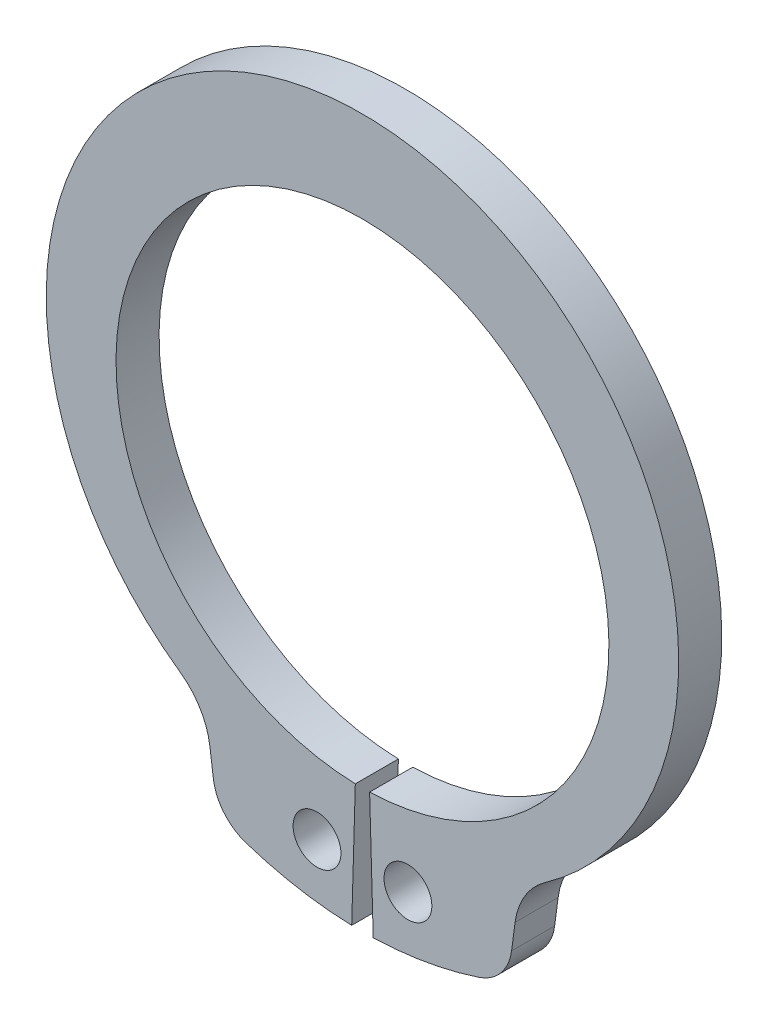
ISO-10303-21;
HEADER;
FILE_DESCRIPTION(('STEP AP214'),'2;1');
FILE_NAME('part.step','',(''),(''),'','','');
FILE_SCHEMA(('AUTOMOTIVE_DESIGN { 1 0 10303 214 1 1 1 1 }'));
ENDSEC;
DATA;
#1=APPLICATION_CONTEXT('core data for automotive mechanical design processes');
#2=APPLICATION_PROTOCOL_DEFINITION('international standard','automotive_design',2000,#1);
#3=PRODUCT_CONTEXT('',#1,'mechanical');
#4=PRODUCT('Part','Part','',(#3));
#5=PRODUCT_RELATED_PRODUCT_CATEGORY('part','',(#4));
#6=PRODUCT_DEFINITION_FORMATION('','',#4);
#7=PRODUCT_DEFINITION_CONTEXT('part definition',#1,'design');
#8=PRODUCT_DEFINITION('design','',#6,#7);
#9=PRODUCT_DEFINITION_SHAPE('','',#8);
#10=(LENGTH_UNIT() NAMED_UNIT(*) SI_UNIT(.MILLI.,.METRE.));
#11=(NAMED_UNIT(*) PLANE_ANGLE_UNIT() SI_UNIT($,.RADIAN.));
#12=(NAMED_UNIT(*) SI_UNIT($,.STERADIAN.) SOLID_ANGLE_UNIT());
#13=UNCERTAINTY_MEASURE_WITH_UNIT(LENGTH_MEASURE(1.E-05),#10,'distance_accuracy_value','');
#14=(GEOMETRIC_REPRESENTATION_CONTEXT(3) GLOBAL_UNCERTAINTY_ASSIGNED_CONTEXT((#13)) GLOBAL_UNIT_ASSIGNED_CONTEXT((#10,
#11,#12)) REPRESENTATION_CONTEXT('',''));
#15=CARTESIAN_POINT('',(0.,0.,0.));
#16=DIRECTION('',(0.,0.,1.));
#17=DIRECTION('',(1.,0.,0.));
#18=AXIS2_PLACEMENT_3D('',#15,#16,#17);
#19=CARTESIAN_POINT('',(0.,0.,-0.9));
#20=DIRECTION('',(0.,0.,1.));
#21=DIRECTION('',(1.,0.,0.));
#22=AXIS2_PLACEMENT_3D('',#19,#20,#21);
#23=CYLINDRICAL_SURFACE('',#22,5.15);
#24=CARTESIAN_POINT('',(0.,0.,0.));
#25=DIRECTION('',(0.,0.,-1.));
#26=DIRECTION('',(1.,0.,0.));
#27=AXIS2_PLACEMENT_3D('',#24,#25,#26);
#28=CIRCLE('',#27,5.15);
#29=CARTESIAN_POINT('',(-0.149516129032258,-5.14782914704434,0.));
#30=VERTEX_POINT('',#29);
#31=CARTESIAN_POINT('',(0.149516129032258,-5.14782914704434,0.));
#32=VERTEX_POINT('',#31);
#33=EDGE_CURVE('E151',#30,#32,#28,.T.);
#34=ORIENTED_EDGE('',*,*,#33,.F.);
#35=DIRECTION('',(0.,0.,1.));
#36=VECTOR('',#35,1.);
#37=CARTESIAN_POINT('',(-0.149516129032258,-5.14782914704434,-0.9));
#38=LINE('',#37,#36);
#39=CARTESIAN_POINT('',(-0.149516129032258,-5.14782914704434,-0.9));
#40=VERTEX_POINT('',#39);
#41=EDGE_CURVE('E11',#40,#30,#38,.T.);
#42=ORIENTED_EDGE('',*,*,#41,.F.);
#43=CARTESIAN_POINT('',(0.,0.,-0.9));
#44=DIRECTION('',(0.,0.,-1.));
#45=DIRECTION('',(1.,0.,0.));
#46=AXIS2_PLACEMENT_3D('',#43,#44,#45);
#47=CIRCLE('',#46,5.15);
#48=CARTESIAN_POINT('',(0.149516129032258,-5.14782914704434,-0.9));
#49=VERTEX_POINT('',#48);
#50=EDGE_CURVE('E184',#40,#49,#47,.T.);
#51=ORIENTED_EDGE('',*,*,#50,.T.);
#52=DIRECTION('',(0.,0.,1.));
#53=VECTOR('',#52,1.);
#54=CARTESIAN_POINT('',(0.149516129032258,-5.14782914704434,-0.9));
#55=LINE('',#54,#53);
#56=EDGE_CURVE('E33',#49,#32,#55,.T.);
#57=ORIENTED_EDGE('',*,*,#56,.T.);
#58=EDGE_LOOP('',(#34,#42,#51,#57));
#59=FACE_BOUND('',#58,.T.);
#60=ADVANCED_FACE('F30',(#59),#23,.F.);
#61=CARTESIAN_POINT('',(-0.149516129032258,-5.14782914704434,-0.9));
#62=DIRECTION('',(0.99957847515424,-0.0290322580645161,0.));
#63=DIRECTION('',(0.0290322580645161,0.99957847515424,0.));
#64=AXIS2_PLACEMENT_3D('',#61,#62,#63);
#65=PLANE('',#64);
#66=DIRECTION('',(0.0290322580645161,0.99957847515424,0.));
#67=VECTOR('',#66,1.);
#68=CARTESIAN_POINT('',(-0.149516129032258,-5.14782914704434,0.));
#69=LINE('',#68,#67);
#70=CARTESIAN_POINT('',(-0.225,-7.74673318244536,0.));
#71=VERTEX_POINT('',#70);
#72=EDGE_CURVE('E182',#71,#30,#69,.T.);
#73=ORIENTED_EDGE('',*,*,#72,.F.);
#74=DIRECTION('',(0.,0.,1.));
#75=VECTOR('',#74,1.);
#76=CARTESIAN_POINT('',(-0.225,-7.74673318244536,-0.9));
#77=LINE('',#76,#75);
#78=CARTESIAN_POINT('',(-0.225,-7.74673318244536,-0.9));
#79=VERTEX_POINT('',#78);
#80=EDGE_CURVE('E39',#79,#71,#77,.T.);
#81=ORIENTED_EDGE('',*,*,#80,.F.);
#82=DIRECTION('',(0.0290322580645161,0.99957847515424,0.));
#83=VECTOR('',#82,1.);
#84=CARTESIAN_POINT('',(-0.149516129032258,-5.14782914704434,-0.9));
#85=LINE('',#84,#83);
#86=EDGE_CURVE('E141',#79,#40,#85,.T.);
#87=ORIENTED_EDGE('',*,*,#86,.T.);
#88=ORIENTED_EDGE('',*,*,#41,.T.);
#89=EDGE_LOOP('',(#73,#81,#87,#88));
#90=FACE_BOUND('',#89,.T.);
#91=ADVANCED_FACE('F204',(#90),#65,.T.);
#92=CARTESIAN_POINT('',(0.,0.,-0.9));
#93=DIRECTION('',(0.,0.,1.));
#94=DIRECTION('',(1.,0.,0.));
#95=AXIS2_PLACEMENT_3D('',#92,#93,#94);
#96=CYLINDRICAL_SURFACE('',#95,7.75);
#97=CARTESIAN_POINT('',(0.,0.,0.));
#98=DIRECTION('',(0.,0.,1.));
#99=DIRECTION('',(1.,0.,0.));
#100=AXIS2_PLACEMENT_3D('',#97,#98,#99);
#101=CIRCLE('',#100,7.75);
#102=CARTESIAN_POINT('',(-2.43932707042662,-7.35609838457071,0.));
#103=VERTEX_POINT('',#102);
#104=EDGE_CURVE('E128',#103,#71,#101,.T.);
#105=ORIENTED_EDGE('',*,*,#104,.F.);
#106=DIRECTION('',(0.,0.,1.));
#107=VECTOR('',#106,1.);
#108=CARTESIAN_POINT('',(-2.43932707042662,-7.35609838457071,-0.9));
#109=LINE('',#108,#107);
#110=CARTESIAN_POINT('',(-2.43932707042662,-7.35609838457071,-0.9));
#111=VERTEX_POINT('',#110);
#112=EDGE_CURVE('E123',#111,#103,#109,.T.);
#113=ORIENTED_EDGE('',*,*,#112,.F.);
#114=CARTESIAN_POINT('',(0.,0.,-0.9));
#115=DIRECTION('',(0.,0.,1.));
#116=DIRECTION('',(1.,0.,0.));
#117=AXIS2_PLACEMENT_3D('',#114,#115,#116);
#118=CIRCLE('',#117,7.75);
#119=EDGE_CURVE('E126',#111,#79,#118,.T.);
#120=ORIENTED_EDGE('',*,*,#119,.T.);
#121=ORIENTED_EDGE('',*,*,#80,.T.);
#122=EDGE_LOOP('',(#105,#113,#120,#121));
#123=FACE_BOUND('',#122,.T.);
#124=ADVANCED_FACE('F125',(#123),#96,.T.);
#125=CARTESIAN_POINT('',(-2.12457519037158,-6.40692439946482,-0.9));
#126=DIRECTION('',(0.,0.,1.));
#127=DIRECTION('',(1.,0.,0.));
#128=AXIS2_PLACEMENT_3D('',#125,#126,#127);
#129=CYLINDRICAL_SURFACE('',#128,1.);
#130=CARTESIAN_POINT('',(-2.12457519037158,-6.40692439946482,0.));
#131=DIRECTION('',(0.,0.,1.));
#132=DIRECTION('',(1.,0.,0.));
#133=AXIS2_PLACEMENT_3D('',#130,#131,#132);
#134=CIRCLE('',#133,1.);
#135=CARTESIAN_POINT('',(-3.11602005174539,-6.53745059168487,0.));
#136=VERTEX_POINT('',#135);
#137=EDGE_CURVE('E179',#136,#103,#134,.T.);
#138=ORIENTED_EDGE('',*,*,#137,.F.);
#139=DIRECTION('',(0.,0.,1.));
#140=VECTOR('',#139,1.);
#141=CARTESIAN_POINT('',(-3.11602005174539,-6.53745059168487,-0.9));
#142=LINE('',#141,#140);
#143=CARTESIAN_POINT('',(-3.11602005174539,-6.53745059168487,-0.9));
#144=VERTEX_POINT('',#143);
#145=EDGE_CURVE('E133',#144,#136,#142,.T.);
#146=ORIENTED_EDGE('',*,*,#145,.F.);
#147=CARTESIAN_POINT('',(-2.12457519037158,-6.40692439946482,-0.9));
#148=DIRECTION('',(0.,0.,1.));
#149=DIRECTION('',(1.,0.,0.));
#150=AXIS2_PLACEMENT_3D('',#147,#148,#149);
#151=CIRCLE('',#150,1.);
#152=EDGE_CURVE('E139',#144,#111,#151,.T.);
#153=ORIENTED_EDGE('',*,*,#152,.T.);
#154=ORIENTED_EDGE('',*,*,#112,.T.);
#155=EDGE_LOOP('',(#138,#146,#153,#154));
#156=FACE_BOUND('',#155,.T.);
#157=ADVANCED_FACE('F143',(#156),#129,.T.);
#158=CARTESIAN_POINT('',(-3.18866917349961,-5.98562572633434,-0.9));
#159=DIRECTION('',(-0.99144486137381,-0.130526192220052,0.));
#160=DIRECTION('',(0.130526192220052,-0.99144486137381,0.));
#161=AXIS2_PLACEMENT_3D('',#158,#159,#160);
#162=PLANE('',#161);
#163=DIRECTION('',(0.130526192220052,-0.99144486137381,0.));
#164=VECTOR('',#163,1.);
#165=CARTESIAN_POINT('',(-3.18866917349961,-5.98562572633434,0.));
#166=LINE('',#165,#164);
#167=CARTESIAN_POINT('',(-3.18866917349961,-5.98562572633434,0.));
#168=VERTEX_POINT('',#167);
#169=EDGE_CURVE('E176',#168,#136,#166,.T.);
#170=ORIENTED_EDGE('',*,*,#169,.F.);
#171=DIRECTION('',(0.,0.,1.));
#172=VECTOR('',#171,1.);
#173=CARTESIAN_POINT('',(-3.18866917349961,-5.98562572633434,-0.9));
#174=LINE('',#173,#172);
#175=CARTESIAN_POINT('',(-3.18866917349961,-5.98562572633434,-0.9));
#176=VERTEX_POINT('',#175);
#177=EDGE_CURVE('E188',#176,#168,#174,.T.);
#178=ORIENTED_EDGE('',*,*,#177,.F.);
#179=DIRECTION('',(0.130526192220052,-0.99144486137381,0.));
#180=VECTOR('',#179,1.);
#181=CARTESIAN_POINT('',(-3.18866917349961,-5.98562572633434,-0.9));
#182=LINE('',#181,#180);
#183=EDGE_CURVE('E144',#176,#144,#182,.T.);
#184=ORIENTED_EDGE('',*,*,#183,.T.);
#185=ORIENTED_EDGE('',*,*,#145,.T.);
#186=EDGE_LOOP('',(#170,#178,#184,#185));
#187=FACE_BOUND('',#186,.T.);
#188=ADVANCED_FACE('F217',(#187),#162,.T.);
#189=CARTESIAN_POINT('',(-4.67484922074798,-6.18128504141914,-0.9));
#190=DIRECTION('',(0.,0.,1.));
#191=DIRECTION('',(1.,0.,0.));
#192=AXIS2_PLACEMENT_3D('',#189,#190,#191);
#193=CYLINDRICAL_SURFACE('',#192,1.49900423629108);
#194=CARTESIAN_POINT('',(-4.67484922074798,-6.18128504141914,0.));
#195=DIRECTION('',(0.,0.,-1.));
#196=DIRECTION('',(1.,0.,0.));
#197=AXIS2_PLACEMENT_3D('',#194,#195,#196);
#198=CIRCLE('',#197,1.49900423629108);
#199=CARTESIAN_POINT('',(-3.81045349680799,-4.95660805018722,0.));
#200=VERTEX_POINT('',#199);
#201=EDGE_CURVE('E173',#200,#168,#198,.T.);
#202=ORIENTED_EDGE('',*,*,#201,.F.);
#203=DIRECTION('',(0.,0.,1.));
#204=VECTOR('',#203,1.);
#205=CARTESIAN_POINT('',(-3.81045349680799,-4.95660805018722,-0.9));
#206=LINE('',#205,#204);
#207=CARTESIAN_POINT('',(-3.81045349680799,-4.95660805018722,-0.9));
#208=VERTEX_POINT('',#207);
#209=EDGE_CURVE('E190',#208,#200,#206,.T.);
#210=ORIENTED_EDGE('',*,*,#209,.F.);
#211=CARTESIAN_POINT('',(-4.67484922074798,-6.18128504141914,-0.9));
#212=DIRECTION('',(0.,0.,-1.));
#213=DIRECTION('',(1.,0.,0.));
#214=AXIS2_PLACEMENT_3D('',#211,#212,#213);
#215=CIRCLE('',#214,1.49900423629108);
#216=EDGE_CURVE('E146',#208,#176,#215,.T.);
#217=ORIENTED_EDGE('',*,*,#216,.T.);
#218=ORIENTED_EDGE('',*,*,#177,.T.);
#219=EDGE_LOOP('',(#202,#210,#217,#218));
#220=FACE_BOUND('',#219,.T.);
#221=ADVANCED_FACE('F220',(#220),#193,.F.);
#222=CARTESIAN_POINT('',(0.,0.442047443420854,-0.9));
#223=DIRECTION('',(0.,0.,1.));
#224=DIRECTION('',(1.,0.,0.));
#225=AXIS2_PLACEMENT_3D('',#222,#223,#224);
#226=CYLINDRICAL_SURFACE('',#225,6.60795255657915);
#227=CARTESIAN_POINT('',(0.,0.442047443420854,0.));
#228=DIRECTION('',(0.,0.,1.));
#229=DIRECTION('',(1.,0.,0.));
#230=AXIS2_PLACEMENT_3D('',#227,#228,#229);
#231=CIRCLE('',#230,6.60795255657915);
#232=CARTESIAN_POINT('',(3.81045349680799,-4.95660805018722,0.));
#233=VERTEX_POINT('',#232);
#234=EDGE_CURVE('E170',#233,#200,#231,.T.);
#235=ORIENTED_EDGE('',*,*,#234,.F.);
#236=DIRECTION('',(0.,0.,1.));
#237=VECTOR('',#236,1.);
#238=CARTESIAN_POINT('',(3.81045349680799,-4.95660805018722,-0.9));
#239=LINE('',#238,#237);
#240=CARTESIAN_POINT('',(3.81045349680799,-4.95660805018722,-0.9));
#241=VERTEX_POINT('',#240);
#242=EDGE_CURVE('E192',#241,#233,#239,.T.);
#243=ORIENTED_EDGE('',*,*,#242,.F.);
#244=CARTESIAN_POINT('',(0.,0.442047443420854,-0.9));
#245=DIRECTION('',(0.,0.,1.));
#246=DIRECTION('',(1.,0.,0.));
#247=AXIS2_PLACEMENT_3D('',#244,#245,#246);
#248=CIRCLE('',#247,6.60795255657915);
#249=EDGE_CURVE('E294',#241,#208,#248,.T.);
#250=ORIENTED_EDGE('',*,*,#249,.T.);
#251=ORIENTED_EDGE('',*,*,#209,.T.);
#252=EDGE_LOOP('',(#235,#243,#250,#251));
#253=FACE_BOUND('',#252,.T.);
#254=ADVANCED_FACE('F224',(#253),#226,.T.);
#255=CARTESIAN_POINT('',(4.67484922074798,-6.18128504141914,-0.9));
#256=DIRECTION('',(0.,0.,1.));
#257=DIRECTION('',(1.,0.,0.));
#258=AXIS2_PLACEMENT_3D('',#255,#256,#257);
#259=CYLINDRICAL_SURFACE('',#258,1.49900423629108);
#260=CARTESIAN_POINT('',(4.67484922074798,-6.18128504141914,0.));
#261=DIRECTION('',(0.,0.,-1.));
#262=DIRECTION('',(1.,0.,0.));
#263=AXIS2_PLACEMENT_3D('',#260,#261,#262);
#264=CIRCLE('',#263,1.49900423629108);
#265=CARTESIAN_POINT('',(3.18866917349961,-5.98562572633434,0.));
#266=VERTEX_POINT('',#265);
#267=EDGE_CURVE('E167',#266,#233,#264,.T.);
#268=ORIENTED_EDGE('',*,*,#267,.F.);
#269=DIRECTION('',(0.,0.,1.));
#270=VECTOR('',#269,1.);
#271=CARTESIAN_POINT('',(3.18866917349961,-5.98562572633434,-0.9));
#272=LINE('',#271,#270);
#273=CARTESIAN_POINT('',(3.18866917349961,-5.98562572633434,-0.9));
#274=VERTEX_POINT('',#273);
#275=EDGE_CURVE('E194',#274,#266,#272,.T.);
#276=ORIENTED_EDGE('',*,*,#275,.F.);
#277=CARTESIAN_POINT('',(4.67484922074798,-6.18128504141914,-0.9));
#278=DIRECTION('',(0.,0.,-1.));
#279=DIRECTION('',(1.,0.,0.));
#280=AXIS2_PLACEMENT_3D('',#277,#278,#279);
#281=CIRCLE('',#280,1.49900423629108);
#282=EDGE_CURVE('E291',#274,#241,#281,.T.);
#283=ORIENTED_EDGE('',*,*,#282,.T.);
#284=ORIENTED_EDGE('',*,*,#242,.T.);
#285=EDGE_LOOP('',(#268,#276,#283,#284));
#286=FACE_BOUND('',#285,.T.);
#287=ADVANCED_FACE('F228',(#286),#259,.F.);
#288=CARTESIAN_POINT('',(3.18866917349961,-5.98562572633434,-0.9));
#289=DIRECTION('',(0.99144486137381,-0.130526192220052,0.));
#290=DIRECTION('',(0.130526192220052,0.99144486137381,0.));
#291=AXIS2_PLACEMENT_3D('',#288,#289,#290);
#292=PLANE('',#291);
#293=DIRECTION('',(0.130526192220052,0.99144486137381,0.));
#294=VECTOR('',#293,1.);
#295=CARTESIAN_POINT('',(3.18866917349961,-5.98562572633434,0.));
#296=LINE('',#295,#294);
#297=CARTESIAN_POINT('',(3.11602005174539,-6.53745059168487,0.));
#298=VERTEX_POINT('',#297);
#299=EDGE_CURVE('E164',#298,#266,#296,.T.);
#300=ORIENTED_EDGE('',*,*,#299,.F.);
#301=DIRECTION('',(0.,0.,1.));
#302=VECTOR('',#301,1.);
#303=CARTESIAN_POINT('',(3.11602005174539,-6.53745059168487,-0.9));
#304=LINE('',#303,#302);
#305=CARTESIAN_POINT('',(3.11602005174539,-6.53745059168487,-0.9));
#306=VERTEX_POINT('',#305);
#307=EDGE_CURVE('E196',#306,#298,#304,.T.);
#308=ORIENTED_EDGE('',*,*,#307,.F.);
#309=DIRECTION('',(0.130526192220052,0.99144486137381,0.));
#310=VECTOR('',#309,1.);
#311=CARTESIAN_POINT('',(3.18866917349961,-5.98562572633434,-0.9));
#312=LINE('',#311,#310);
#313=EDGE_CURVE('E288',#306,#274,#312,.T.);
#314=ORIENTED_EDGE('',*,*,#313,.T.);
#315=ORIENTED_EDGE('',*,*,#275,.T.);
#316=EDGE_LOOP('',(#300,#308,#314,#315));
#317=FACE_BOUND('',#316,.T.);
#318=ADVANCED_FACE('F232',(#317),#292,.T.);
#319=CARTESIAN_POINT('',(2.12457519037158,-6.40692439946482,-0.9));
#320=DIRECTION('',(0.,0.,1.));
#321=DIRECTION('',(1.,0.,0.));
#322=AXIS2_PLACEMENT_3D('',#319,#320,#321);
#323=CYLINDRICAL_SURFACE('',#322,1.);
#324=CARTESIAN_POINT('',(2.12457519037158,-6.40692439946482,0.));
#325=DIRECTION('',(0.,0.,1.));
#326=DIRECTION('',(-1.,0.,0.));
#327=AXIS2_PLACEMENT_3D('',#324,#325,#326);
#328=CIRCLE('',#327,1.);
#329=CARTESIAN_POINT('',(2.43932707042662,-7.35609838457071,0.));
#330=VERTEX_POINT('',#329);
#331=EDGE_CURVE('E161',#330,#298,#328,.T.);
#332=ORIENTED_EDGE('',*,*,#331,.F.);
#333=DIRECTION('',(0.,0.,1.));
#334=VECTOR('',#333,1.);
#335=CARTESIAN_POINT('',(2.43932707042662,-7.35609838457071,-0.9));
#336=LINE('',#335,#334);
#337=CARTESIAN_POINT('',(2.43932707042662,-7.35609838457071,-0.9));
#338=VERTEX_POINT('',#337);
#339=EDGE_CURVE('E198',#338,#330,#336,.T.);
#340=ORIENTED_EDGE('',*,*,#339,.F.);
#341=CARTESIAN_POINT('',(2.12457519037158,-6.40692439946482,-0.9));
#342=DIRECTION('',(0.,0.,1.));
#343=DIRECTION('',(-1.,0.,0.));
#344=AXIS2_PLACEMENT_3D('',#341,#342,#343);
#345=CIRCLE('',#344,1.);
#346=EDGE_CURVE('E285',#338,#306,#345,.T.);
#347=ORIENTED_EDGE('',*,*,#346,.T.);
#348=ORIENTED_EDGE('',*,*,#307,.T.);
#349=EDGE_LOOP('',(#332,#340,#347,#348));
#350=FACE_BOUND('',#349,.T.);
#351=ADVANCED_FACE('F236',(#350),#323,.T.);
#352=CARTESIAN_POINT('',(0.,0.,-0.9));
#353=DIRECTION('',(0.,0.,1.));
#354=DIRECTION('',(1.,0.,0.));
#355=AXIS2_PLACEMENT_3D('',#352,#353,#354);
#356=CYLINDRICAL_SURFACE('',#355,7.75);
#357=CARTESIAN_POINT('',(0.,0.,0.));
#358=DIRECTION('',(0.,0.,1.));
#359=DIRECTION('',(1.,0.,0.));
#360=AXIS2_PLACEMENT_3D('',#357,#358,#359);
#361=CIRCLE('',#360,7.75);
#362=CARTESIAN_POINT('',(0.224999999999997,-7.74673318244536,0.));
#363=VERTEX_POINT('',#362);
#364=EDGE_CURVE('E158',#363,#330,#361,.T.);
#365=ORIENTED_EDGE('',*,*,#364,.F.);
#366=DIRECTION('',(0.,0.,1.));
#367=VECTOR('',#366,1.);
#368=CARTESIAN_POINT('',(0.224999999999997,-7.74673318244536,-0.9));
#369=LINE('',#368,#367);
#370=CARTESIAN_POINT('',(0.224999999999997,-7.74673318244536,-0.9));
#371=VERTEX_POINT('',#370);
#372=EDGE_CURVE('E199',#371,#363,#369,.T.);
#373=ORIENTED_EDGE('',*,*,#372,.F.);
#374=CARTESIAN_POINT('',(0.,0.,-0.9));
#375=DIRECTION('',(0.,0.,1.));
#376=DIRECTION('',(1.,0.,0.));
#377=AXIS2_PLACEMENT_3D('',#374,#375,#376);
#378=CIRCLE('',#377,7.75);
#379=EDGE_CURVE('E282',#371,#338,#378,.T.);
#380=ORIENTED_EDGE('',*,*,#379,.T.);
#381=ORIENTED_EDGE('',*,*,#339,.T.);
#382=EDGE_LOOP('',(#365,#373,#380,#381));
#383=FACE_BOUND('',#382,.T.);
#384=ADVANCED_FACE('F240',(#383),#356,.T.);
#385=CARTESIAN_POINT('',(0.149516129032258,-5.14782914704434,-0.9));
#386=DIRECTION('',(-0.99957847515424,-0.0290322580645161,0.));
#387=DIRECTION('',(0.0290322580645161,-0.99957847515424,0.));
#388=AXIS2_PLACEMENT_3D('',#385,#386,#387);
#389=PLANE('',#388);
#390=DIRECTION('',(0.0290322580645161,-0.99957847515424,0.));
#391=VECTOR('',#390,1.);
#392=CARTESIAN_POINT('',(0.149516129032258,-5.14782914704434,0.));
#393=LINE('',#392,#391);
#394=EDGE_CURVE('E154',#32,#363,#393,.T.);
#395=ORIENTED_EDGE('',*,*,#394,.F.);
#396=ORIENTED_EDGE('',*,*,#56,.F.);
#397=DIRECTION('',(0.0290322580645161,-0.99957847515424,0.));
#398=VECTOR('',#397,1.);
#399=CARTESIAN_POINT('',(0.149516129032258,-5.14782914704434,-0.9));
#400=LINE('',#399,#398);
#401=EDGE_CURVE('E280',#49,#371,#400,.T.);
#402=ORIENTED_EDGE('',*,*,#401,.T.);
#403=ORIENTED_EDGE('',*,*,#372,.T.);
#404=EDGE_LOOP('',(#395,#396,#402,#403));
#405=FACE_BOUND('',#404,.T.);
#406=ADVANCED_FACE('F201',(#405),#389,.T.);
#407=CARTESIAN_POINT('',(0.,0.,-0.9));
#408=DIRECTION('',(0.,0.,1.));
#409=DIRECTION('',(1.,0.,0.));
#410=AXIS2_PLACEMENT_3D('',#407,#408,#409);
#411=PLANE('',#410);
#412=CARTESIAN_POINT('',(-0.95,-6.55653300151841,-0.9));
#413=DIRECTION('',(0.,0.,1.));
#414=DIRECTION('',(1.,0.,0.));
#415=AXIS2_PLACEMENT_3D('',#412,#413,#414);
#416=CIRCLE('',#415,0.5);
#417=CARTESIAN_POINT('',(-0.45,-6.55653300151841,-0.9));
#418=VERTEX_POINT('',#417);
#419=EDGE_CURVE('E267',#418,#418,#416,.T.);
#420=ORIENTED_EDGE('',*,*,#419,.T.);
#421=EDGE_LOOP('',(#420));
#422=FACE_BOUND('',#421,.T.);
#423=CARTESIAN_POINT('',(0.95,-6.55653300151841,-0.9));
#424=DIRECTION('',(0.,0.,1.));
#425=DIRECTION('',(1.,0.,0.));
#426=AXIS2_PLACEMENT_3D('',#423,#424,#425);
#427=CIRCLE('',#426,0.5);
#428=CARTESIAN_POINT('',(1.45,-6.55653300151841,-0.9));
#429=VERTEX_POINT('',#428);
#430=EDGE_CURVE('E155',#429,#429,#427,.T.);
#431=ORIENTED_EDGE('',*,*,#430,.T.);
#432=EDGE_LOOP('',(#431));
#433=FACE_BOUND('',#432,.T.);
#434=ORIENTED_EDGE('',*,*,#50,.F.);
#435=ORIENTED_EDGE('',*,*,#86,.F.);
#436=ORIENTED_EDGE('',*,*,#119,.F.);
#437=ORIENTED_EDGE('',*,*,#152,.F.);
#438=ORIENTED_EDGE('',*,*,#183,.F.);
#439=ORIENTED_EDGE('',*,*,#216,.F.);
#440=ORIENTED_EDGE('',*,*,#249,.F.);
#441=ORIENTED_EDGE('',*,*,#282,.F.);
#442=ORIENTED_EDGE('',*,*,#313,.F.);
#443=ORIENTED_EDGE('',*,*,#346,.F.);
#444=ORIENTED_EDGE('',*,*,#379,.F.);
#445=ORIENTED_EDGE('',*,*,#401,.F.);
#446=EDGE_LOOP('',(#434,#435,#436,#437,#438,#439,#440,#441,#442,#443,#444,#445));
#447=FACE_BOUND('',#446,.T.);
#448=ADVANCED_FACE('F137',(#422,#433,#447),#411,.F.);
#449=CARTESIAN_POINT('',(0.,0.,0.));
#450=DIRECTION('',(0.,0.,1.));
#451=DIRECTION('',(1.,0.,0.));
#452=AXIS2_PLACEMENT_3D('',#449,#450,#451);
#453=PLANE('',#452);
#454=CARTESIAN_POINT('',(-0.95,-6.55653300151841,0.));
#455=DIRECTION('',(0.,0.,1.));
#456=DIRECTION('',(1.,0.,0.));
#457=AXIS2_PLACEMENT_3D('',#454,#455,#456);
#458=CIRCLE('',#457,0.5);
#459=CARTESIAN_POINT('',(-0.45,-6.55653300151841,0.));
#460=VERTEX_POINT('',#459);
#461=EDGE_CURVE('E270',#460,#460,#458,.T.);
#462=ORIENTED_EDGE('',*,*,#461,.F.);
#463=EDGE_LOOP('',(#462));
#464=FACE_BOUND('',#463,.T.);
#465=CARTESIAN_POINT('',(0.95,-6.55653300151841,0.));
#466=DIRECTION('',(0.,0.,1.));
#467=DIRECTION('',(1.,0.,0.));
#468=AXIS2_PLACEMENT_3D('',#465,#466,#467);
#469=CIRCLE('',#468,0.5);
#470=CARTESIAN_POINT('',(1.45,-6.55653300151841,0.));
#471=VERTEX_POINT('',#470);
#472=EDGE_CURVE('E272',#471,#471,#469,.T.);
#473=ORIENTED_EDGE('',*,*,#472,.F.);
#474=EDGE_LOOP('',(#473));
#475=FACE_BOUND('',#474,.T.);
#476=ORIENTED_EDGE('',*,*,#33,.T.);
#477=ORIENTED_EDGE('',*,*,#394,.T.);
#478=ORIENTED_EDGE('',*,*,#364,.T.);
#479=ORIENTED_EDGE('',*,*,#331,.T.);
#480=ORIENTED_EDGE('',*,*,#299,.T.);
#481=ORIENTED_EDGE('',*,*,#267,.T.);
#482=ORIENTED_EDGE('',*,*,#234,.T.);
#483=ORIENTED_EDGE('',*,*,#201,.T.);
#484=ORIENTED_EDGE('',*,*,#169,.T.);
#485=ORIENTED_EDGE('',*,*,#137,.T.);
#486=ORIENTED_EDGE('',*,*,#104,.T.);
#487=ORIENTED_EDGE('',*,*,#72,.T.);
#488=EDGE_LOOP('',(#476,#477,#478,#479,#480,#481,#482,#483,#484,#485,#486,#487));
#489=FACE_BOUND('',#488,.T.);
#490=ADVANCED_FACE('F203',(#464,#475,#489),#453,.T.);
#491=CARTESIAN_POINT('',(0.95,-6.55653300151841,-0.9));
#492=DIRECTION('',(0.,0.,1.));
#493=DIRECTION('',(1.,0.,0.));
#494=AXIS2_PLACEMENT_3D('',#491,#492,#493);
#495=CYLINDRICAL_SURFACE('',#494,0.5);
#496=ORIENTED_EDGE('',*,*,#430,.F.);
#497=EDGE_LOOP('',(#496));
#498=FACE_BOUND('',#497,.T.);
#499=ORIENTED_EDGE('',*,*,#472,.T.);
#500=EDGE_LOOP('',(#499));
#501=FACE_BOUND('',#500,.T.);
#502=ADVANCED_FACE('F252',(#498,#501),#495,.F.);
#503=CARTESIAN_POINT('',(-0.95,-6.55653300151841,-0.9));
#504=DIRECTION('',(0.,0.,1.));
#505=DIRECTION('',(1.,0.,0.));
#506=AXIS2_PLACEMENT_3D('',#503,#504,#505);
#507=CYLINDRICAL_SURFACE('',#506,0.5);
#508=ORIENTED_EDGE('',*,*,#419,.F.);
#509=EDGE_LOOP('',(#508));
#510=FACE_BOUND('',#509,.T.);
#511=ORIENTED_EDGE('',*,*,#461,.T.);
#512=EDGE_LOOP('',(#511));
#513=FACE_BOUND('',#512,.T.);
#514=ADVANCED_FACE('F259',(#510,#513),#507,.F.);
#515=CLOSED_SHELL('',(#60,#91,#124,#157,#188,#221,#254,#287,#318,#351,#384,#406,#448,#490,#502,#514));
#516=MANIFOLD_SOLID_BREP('B2',#515);
#517=ADVANCED_BREP_SHAPE_REPRESENTATION('',(#18,#516),#14);
#518=SHAPE_DEFINITION_REPRESENTATION(#9,#517);
ENDSEC;
END-ISO-10303-21;
